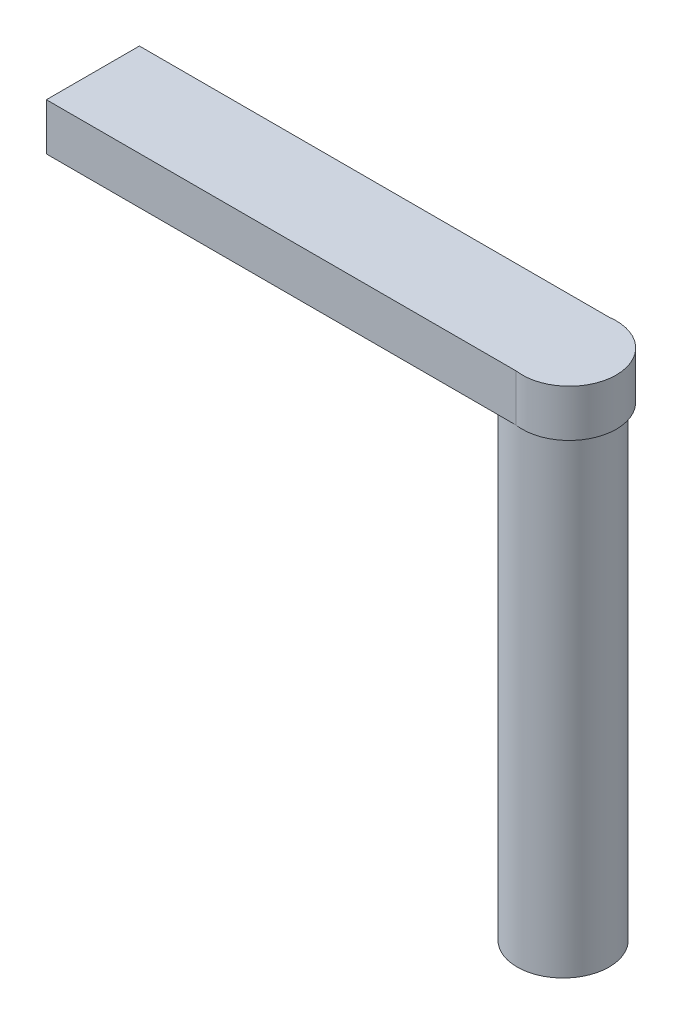
ISO-10303-21;
HEADER;
FILE_DESCRIPTION(('STEP AP214'),'2;1');
FILE_NAME('part.step','',(''),(''),'','','');
FILE_SCHEMA(('AUTOMOTIVE_DESIGN { 1 0 10303 214 1 1 1 1 }'));
ENDSEC;
DATA;
#1=APPLICATION_CONTEXT('core data for automotive mechanical design processes');
#2=APPLICATION_PROTOCOL_DEFINITION('international standard','automotive_design',2000,#1);
#3=PRODUCT_CONTEXT('',#1,'mechanical');
#4=PRODUCT('Part','Part','',(#3));
#5=PRODUCT_RELATED_PRODUCT_CATEGORY('part','',(#4));
#6=PRODUCT_DEFINITION_FORMATION('','',#4);
#7=PRODUCT_DEFINITION_CONTEXT('part definition',#1,'design');
#8=PRODUCT_DEFINITION('design','',#6,#7);
#9=PRODUCT_DEFINITION_SHAPE('','',#8);
#10=(LENGTH_UNIT() NAMED_UNIT(*) SI_UNIT(.MILLI.,.METRE.));
#11=(NAMED_UNIT(*) PLANE_ANGLE_UNIT() SI_UNIT($,.RADIAN.));
#12=(NAMED_UNIT(*) SI_UNIT($,.STERADIAN.) SOLID_ANGLE_UNIT());
#13=UNCERTAINTY_MEASURE_WITH_UNIT(LENGTH_MEASURE(1.E-05),#10,'distance_accuracy_value','');
#14=(GEOMETRIC_REPRESENTATION_CONTEXT(3) GLOBAL_UNCERTAINTY_ASSIGNED_CONTEXT((#13)) GLOBAL_UNIT_ASSIGNED_CONTEXT((#10,
#11,#12)) REPRESENTATION_CONTEXT('',''));
#15=CARTESIAN_POINT('',(0.,0.,0.));
#16=DIRECTION('',(0.,0.,1.));
#17=DIRECTION('',(1.,0.,0.));
#18=AXIS2_PLACEMENT_3D('',#15,#16,#17);
#19=CARTESIAN_POINT('',(0.,50.,0.));
#20=DIRECTION('',(0.,-1.,0.));
#21=DIRECTION('',(0.,0.,-1.));
#22=AXIS2_PLACEMENT_3D('',#19,#20,#21);
#23=CYLINDRICAL_SURFACE('',#22,4.9);
#24=CARTESIAN_POINT('',(0.,50.,0.));
#25=DIRECTION('',(0.,1.,0.));
#26=DIRECTION('',(0.,0.,1.));
#27=AXIS2_PLACEMENT_3D('',#24,#25,#26);
#28=CIRCLE('',#27,4.9);
#29=CARTESIAN_POINT('',(0.,50.,-4.9));
#30=VERTEX_POINT('',#29);
#31=EDGE_CURVE('E11',#30,#30,#28,.T.);
#32=ORIENTED_EDGE('',*,*,#31,.F.);
#33=EDGE_LOOP('',(#32));
#34=FACE_BOUND('',#33,.T.);
#35=CARTESIAN_POINT('',(0.,0.,0.));
#36=DIRECTION('',(0.,1.,0.));
#37=DIRECTION('',(0.,0.,1.));
#38=AXIS2_PLACEMENT_3D('',#35,#36,#37);
#39=CIRCLE('',#38,4.9);
#40=CARTESIAN_POINT('',(0.,0.,4.9));
#41=VERTEX_POINT('',#40);
#42=EDGE_CURVE('E36',#41,#41,#39,.T.);
#43=ORIENTED_EDGE('',*,*,#42,.T.);
#44=EDGE_LOOP('',(#43));
#45=FACE_BOUND('',#44,.T.);
#46=ADVANCED_FACE('F33',(#34,#45),#23,.T.);
#47=CARTESIAN_POINT('',(0.,0.,0.));
#48=DIRECTION('',(0.,1.,0.));
#49=DIRECTION('',(0.,0.,1.));
#50=AXIS2_PLACEMENT_3D('',#47,#48,#49);
#51=PLANE('',#50);
#52=ORIENTED_EDGE('',*,*,#42,.F.);
#53=EDGE_LOOP('',(#52));
#54=FACE_BOUND('',#53,.T.);
#55=ADVANCED_FACE('F113',(#54),#51,.F.);
#56=CARTESIAN_POINT('',(0.705336798983298,50.,0.0499999999999984));
#57=DIRECTION('',(0.,1.,0.));
#58=DIRECTION('',(0.,0.,1.));
#59=AXIS2_PLACEMENT_3D('',#56,#57,#58);
#60=PLANE('',#59);
#61=DIRECTION('',(-1.,0.,0.));
#62=VECTOR('',#61,1.);
#63=CARTESIAN_POINT('',(0.,50.,-4.9));
#64=LINE('',#63,#62);
#65=CARTESIAN_POINT('',(-50.,50.,-4.9));
#66=VERTEX_POINT('',#65);
#67=EDGE_CURVE('E91',#30,#66,#64,.T.);
#68=ORIENTED_EDGE('',*,*,#67,.F.);
#69=ORIENTED_EDGE('',*,*,#31,.T.);
#70=CARTESIAN_POINT('',(0.705336798983298,50.,0.0499999999999984));
#71=DIRECTION('',(0.,1.,0.));
#72=DIRECTION('',(0.,0.,1.));
#73=AXIS2_PLACEMENT_3D('',#70,#71,#72);
#74=CIRCLE('',#73,5.);
#75=CARTESIAN_POINT('',(0.,50.,5.));
#76=VERTEX_POINT('',#75);
#77=EDGE_CURVE('E101',#76,#30,#74,.T.);
#78=ORIENTED_EDGE('',*,*,#77,.F.);
#79=DIRECTION('',(1.,0.,0.));
#80=VECTOR('',#79,1.);
#81=CARTESIAN_POINT('',(0.,50.,5.));
#82=LINE('',#81,#80);
#83=CARTESIAN_POINT('',(-50.,50.,5.00000000000001));
#84=VERTEX_POINT('',#83);
#85=EDGE_CURVE('E72',#84,#76,#82,.T.);
#86=ORIENTED_EDGE('',*,*,#85,.F.);
#87=DIRECTION('',(0.,0.,1.));
#88=VECTOR('',#87,1.);
#89=CARTESIAN_POINT('',(-50.,50.,-4.9));
#90=LINE('',#89,#88);
#91=EDGE_CURVE('E66',#66,#84,#90,.T.);
#92=ORIENTED_EDGE('',*,*,#91,.F.);
#93=EDGE_LOOP('',(#68,#69,#78,#86,#92));
#94=FACE_BOUND('',#93,.T.);
#95=ADVANCED_FACE('F115',(#94),#60,.F.);
#96=CARTESIAN_POINT('',(0.705336798983298,55.,0.0499999999999984));
#97=DIRECTION('',(0.,-1.,0.));
#98=DIRECTION('',(0.,0.,-1.));
#99=AXIS2_PLACEMENT_3D('',#96,#97,#98);
#100=CYLINDRICAL_SURFACE('',#99,5.);
#101=ORIENTED_EDGE('',*,*,#77,.T.);
#102=DIRECTION('',(0.,-1.,0.));
#103=VECTOR('',#102,1.);
#104=CARTESIAN_POINT('',(0.,55.,-4.9));
#105=LINE('',#104,#103);
#106=CARTESIAN_POINT('',(0.,55.,-4.9));
#107=VERTEX_POINT('',#106);
#108=EDGE_CURVE('E92',#107,#30,#105,.T.);
#109=ORIENTED_EDGE('',*,*,#108,.F.);
#110=CARTESIAN_POINT('',(0.705336798983298,55.,0.0499999999999984));
#111=DIRECTION('',(0.,1.,0.));
#112=DIRECTION('',(0.,0.,1.));
#113=AXIS2_PLACEMENT_3D('',#110,#111,#112);
#114=CIRCLE('',#113,5.);
#115=CARTESIAN_POINT('',(0.,55.,5.));
#116=VERTEX_POINT('',#115);
#117=EDGE_CURVE('E85',#116,#107,#114,.T.);
#118=ORIENTED_EDGE('',*,*,#117,.F.);
#119=DIRECTION('',(0.,-1.,0.));
#120=VECTOR('',#119,1.);
#121=CARTESIAN_POINT('',(0.,55.,5.));
#122=LINE('',#121,#120);
#123=EDGE_CURVE('E97',#116,#76,#122,.T.);
#124=ORIENTED_EDGE('',*,*,#123,.T.);
#125=EDGE_LOOP('',(#101,#109,#118,#124));
#126=FACE_BOUND('',#125,.T.);
#127=ADVANCED_FACE('F120',(#126),#100,.T.);
#128=CARTESIAN_POINT('',(0.,55.,-4.9));
#129=DIRECTION('',(0.,0.,1.));
#130=DIRECTION('',(1.,0.,0.));
#131=AXIS2_PLACEMENT_3D('',#128,#129,#130);
#132=PLANE('',#131);
#133=ORIENTED_EDGE('',*,*,#67,.T.);
#134=DIRECTION('',(0.,-1.,0.));
#135=VECTOR('',#134,1.);
#136=CARTESIAN_POINT('',(-50.,55.,-4.9));
#137=LINE('',#136,#135);
#138=CARTESIAN_POINT('',(-50.,55.,-4.9));
#139=VERTEX_POINT('',#138);
#140=EDGE_CURVE('E88',#139,#66,#137,.T.);
#141=ORIENTED_EDGE('',*,*,#140,.F.);
#142=DIRECTION('',(-1.,0.,0.));
#143=VECTOR('',#142,1.);
#144=CARTESIAN_POINT('',(0.,55.,-4.9));
#145=LINE('',#144,#143);
#146=EDGE_CURVE('E80',#107,#139,#145,.T.);
#147=ORIENTED_EDGE('',*,*,#146,.F.);
#148=ORIENTED_EDGE('',*,*,#108,.T.);
#149=EDGE_LOOP('',(#133,#141,#147,#148));
#150=FACE_BOUND('',#149,.T.);
#151=ADVANCED_FACE('F89',(#150),#132,.F.);
#152=CARTESIAN_POINT('',(-50.,55.,-4.9));
#153=DIRECTION('',(1.,0.,0.));
#154=DIRECTION('',(0.,0.,-1.));
#155=AXIS2_PLACEMENT_3D('',#152,#153,#154);
#156=PLANE('',#155);
#157=ORIENTED_EDGE('',*,*,#91,.T.);
#158=DIRECTION('',(0.,-1.,0.));
#159=VECTOR('',#158,1.);
#160=CARTESIAN_POINT('',(-50.,55.,5.00000000000001));
#161=LINE('',#160,#159);
#162=CARTESIAN_POINT('',(-50.,55.,5.00000000000001));
#163=VERTEX_POINT('',#162);
#164=EDGE_CURVE('E93',#163,#84,#161,.T.);
#165=ORIENTED_EDGE('',*,*,#164,.F.);
#166=DIRECTION('',(0.,0.,1.));
#167=VECTOR('',#166,1.);
#168=CARTESIAN_POINT('',(-50.,55.,-4.9));
#169=LINE('',#168,#167);
#170=EDGE_CURVE('E83',#139,#163,#169,.T.);
#171=ORIENTED_EDGE('',*,*,#170,.F.);
#172=ORIENTED_EDGE('',*,*,#140,.T.);
#173=EDGE_LOOP('',(#157,#165,#171,#172));
#174=FACE_BOUND('',#173,.T.);
#175=ADVANCED_FACE('F95',(#174),#156,.F.);
#176=CARTESIAN_POINT('',(0.,55.,5.));
#177=DIRECTION('',(0.,0.,-1.));
#178=DIRECTION('',(-1.,0.,0.));
#179=AXIS2_PLACEMENT_3D('',#176,#177,#178);
#180=PLANE('',#179);
#181=ORIENTED_EDGE('',*,*,#85,.T.);
#182=ORIENTED_EDGE('',*,*,#123,.F.);
#183=DIRECTION('',(1.,0.,0.));
#184=VECTOR('',#183,1.);
#185=CARTESIAN_POINT('',(0.,55.,5.));
#186=LINE('',#185,#184);
#187=EDGE_CURVE('E49',#163,#116,#186,.T.);
#188=ORIENTED_EDGE('',*,*,#187,.F.);
#189=ORIENTED_EDGE('',*,*,#164,.T.);
#190=EDGE_LOOP('',(#181,#182,#188,#189));
#191=FACE_BOUND('',#190,.T.);
#192=ADVANCED_FACE('F132',(#191),#180,.F.);
#193=CARTESIAN_POINT('',(0.705336798983298,55.,0.0499999999999984));
#194=DIRECTION('',(0.,1.,0.));
#195=DIRECTION('',(0.,0.,1.));
#196=AXIS2_PLACEMENT_3D('',#193,#194,#195);
#197=PLANE('',#196);
#198=ORIENTED_EDGE('',*,*,#117,.T.);
#199=ORIENTED_EDGE('',*,*,#146,.T.);
#200=ORIENTED_EDGE('',*,*,#170,.T.);
#201=ORIENTED_EDGE('',*,*,#187,.T.);
#202=EDGE_LOOP('',(#198,#199,#200,#201));
#203=FACE_BOUND('',#202,.T.);
#204=ADVANCED_FACE('F81',(#203),#197,.T.);
#205=CLOSED_SHELL('',(#46,#55,#95,#127,#151,#175,#192,#204));
#206=MANIFOLD_SOLID_BREP('B2',#205);
#207=ADVANCED_BREP_SHAPE_REPRESENTATION('',(#18,#206),#14);
#208=SHAPE_DEFINITION_REPRESENTATION(#9,#207);
ENDSEC;
END-ISO-10303-21;
